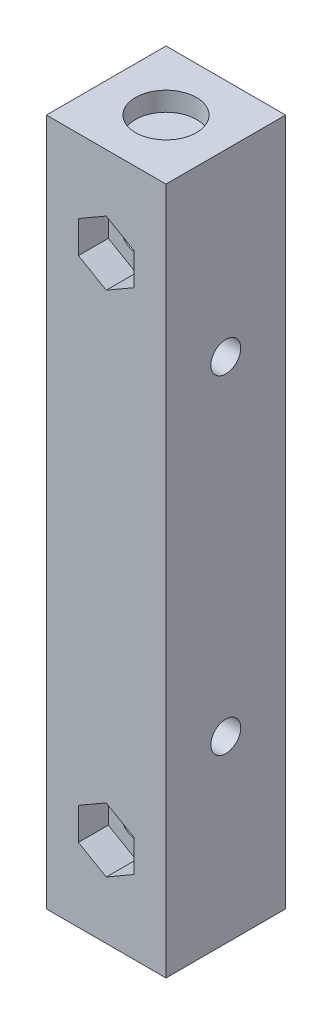
ISO-10303-21;
HEADER;
FILE_DESCRIPTION(('STEP AP214'),'2;1');
FILE_NAME('part.step','',(''),(''),'','','');
FILE_SCHEMA(('AUTOMOTIVE_DESIGN { 1 0 10303 214 1 1 1 1 }'));
ENDSEC;
DATA;
#1=APPLICATION_CONTEXT('core data for automotive mechanical design processes');
#2=APPLICATION_PROTOCOL_DEFINITION('international standard','automotive_design',2000,#1);
#3=PRODUCT_CONTEXT('',#1,'mechanical');
#4=PRODUCT('Part','Part','',(#3));
#5=PRODUCT_RELATED_PRODUCT_CATEGORY('part','',(#4));
#6=PRODUCT_DEFINITION_FORMATION('','',#4);
#7=PRODUCT_DEFINITION_CONTEXT('part definition',#1,'design');
#8=PRODUCT_DEFINITION('design','',#6,#7);
#9=PRODUCT_DEFINITION_SHAPE('','',#8);
#10=(LENGTH_UNIT() NAMED_UNIT(*) SI_UNIT(.MILLI.,.METRE.));
#11=(NAMED_UNIT(*) PLANE_ANGLE_UNIT() SI_UNIT($,.RADIAN.));
#12=(NAMED_UNIT(*) SI_UNIT($,.STERADIAN.) SOLID_ANGLE_UNIT());
#13=UNCERTAINTY_MEASURE_WITH_UNIT(LENGTH_MEASURE(1.E-05),#10,'distance_accuracy_value','');
#14=(GEOMETRIC_REPRESENTATION_CONTEXT(3) GLOBAL_UNCERTAINTY_ASSIGNED_CONTEXT((#13)) GLOBAL_UNIT_ASSIGNED_CONTEXT((#10,
#11,#12)) REPRESENTATION_CONTEXT('',''));
#15=CARTESIAN_POINT('',(0.,0.,0.));
#16=DIRECTION('',(0.,0.,1.));
#17=DIRECTION('',(1.,0.,0.));
#18=AXIS2_PLACEMENT_3D('',#15,#16,#17);
#19=CARTESIAN_POINT('',(865.,5.,-700.));
#20=DIRECTION('',(0.,1.,0.));
#21=DIRECTION('',(0.,0.,1.));
#22=AXIS2_PLACEMENT_3D('',#19,#20,#21);
#23=PLANE('',#22);
#24=DIRECTION('',(0.,0.,1.));
#25=VECTOR('',#24,1.);
#26=CARTESIAN_POINT('',(0.,5.,0.));
#27=LINE('',#26,#25);
#28=CARTESIAN_POINT('',(0.,5.,-20.));
#29=VERTEX_POINT('',#28);
#30=CARTESIAN_POINT('',(0.,5.,0.));
#31=VERTEX_POINT('',#30);
#32=EDGE_CURVE('E44',#29,#31,#27,.T.);
#33=ORIENTED_EDGE('',*,*,#32,.F.);
#34=DIRECTION('',(-1.,0.,0.));
#35=VECTOR('',#34,1.);
#36=CARTESIAN_POINT('',(0.,5.,-20.));
#37=LINE('',#36,#35);
#38=CARTESIAN_POINT('',(20.,5.,-20.));
#39=VERTEX_POINT('',#38);
#40=EDGE_CURVE('E487',#39,#29,#37,.T.);
#41=ORIENTED_EDGE('',*,*,#40,.F.);
#42=DIRECTION('',(0.,0.,-1.));
#43=VECTOR('',#42,1.);
#44=CARTESIAN_POINT('',(20.,5.,0.));
#45=LINE('',#44,#43);
#46=CARTESIAN_POINT('',(20.,5.,0.));
#47=VERTEX_POINT('',#46);
#48=EDGE_CURVE('E481',#47,#39,#45,.T.);
#49=ORIENTED_EDGE('',*,*,#48,.F.);
#50=DIRECTION('',(1.,0.,0.));
#51=VECTOR('',#50,1.);
#52=CARTESIAN_POINT('',(0.,5.,0.));
#53=LINE('',#52,#51);
#54=EDGE_CURVE('E510',#31,#47,#53,.T.);
#55=ORIENTED_EDGE('',*,*,#54,.F.);
#56=EDGE_LOOP('',(#33,#41,#49,#55));
#57=FACE_BOUND('',#56,.T.);
#58=ADVANCED_FACE('F40',(#57),#23,.F.);
#59=CARTESIAN_POINT('',(10.,116.8,-10.));
#60=DIRECTION('',(0.,1.,0.));
#61=DIRECTION('',(0.,0.,1.));
#62=AXIS2_PLACEMENT_3D('',#59,#60,#61);
#63=PLANE('',#62);
#64=CARTESIAN_POINT('',(10.,116.8,-10.));
#65=DIRECTION('',(0.,1.,0.));
#66=DIRECTION('',(0.,0.,1.));
#67=AXIS2_PLACEMENT_3D('',#64,#65,#66);
#68=CIRCLE('',#67,5.1);
#69=CARTESIAN_POINT('',(10.,116.8,-4.9));
#70=VERTEX_POINT('',#69);
#71=EDGE_CURVE('E50',#70,#70,#68,.T.);
#72=ORIENTED_EDGE('',*,*,#71,.T.);
#73=EDGE_LOOP('',(#72));
#74=FACE_BOUND('',#73,.T.);
#75=ADVANCED_FACE('F550',(#74),#63,.T.);
#76=CARTESIAN_POINT('',(5.,-55.,0.));
#77=DIRECTION('',(-1.,0.,0.));
#78=DIRECTION('',(0.,0.,1.));
#79=AXIS2_PLACEMENT_3D('',#76,#77,#78);
#80=PLANE('',#79);
#81=CARTESIAN_POINT('',(5.,35.,-9.99999999999999));
#82=DIRECTION('',(-1.,0.,0.));
#83=DIRECTION('',(0.,0.,1.));
#84=AXIS2_PLACEMENT_3D('',#81,#82,#83);
#85=CIRCLE('',#84,2.5);
#86=CARTESIAN_POINT('',(5.,35.,-7.49999999999999));
#87=VERTEX_POINT('',#86);
#88=EDGE_CURVE('E372',#87,#87,#85,.F.);
#89=ORIENTED_EDGE('',*,*,#88,.T.);
#90=EDGE_LOOP('',(#89));
#91=FACE_BOUND('',#90,.T.);
#92=DIRECTION('',(0.,0.500000000000001,0.866025403784438));
#93=VECTOR('',#92,1.);
#94=CARTESIAN_POINT('',(5.,12.8031088913245,-39.1461431702998));
#95=LINE('',#94,#93);
#96=CARTESIAN_POINT('',(5.,29.6306424965365,-9.99999999999997));
#97=VERTEX_POINT('',#96);
#98=CARTESIAN_POINT('',(5.,32.3153212482682,-5.34999999999999));
#99=VERTEX_POINT('',#98);
#100=EDGE_CURVE('E376',#97,#99,#95,.T.);
#101=ORIENTED_EDGE('',*,*,#100,.T.);
#102=DIRECTION('',(0.,1.,0.));
#103=VECTOR('',#102,1.);
#104=CARTESIAN_POINT('',(5.,-55.,-5.34999999999998));
#105=LINE('',#104,#103);
#106=CARTESIAN_POINT('',(5.,37.6846787517318,-5.34999999999999));
#107=VERTEX_POINT('',#106);
#108=EDGE_CURVE('E379',#99,#107,#105,.T.);
#109=ORIENTED_EDGE('',*,*,#108,.T.);
#110=DIRECTION('',(0.,-0.500000000000001,0.866025403784438));
#111=VECTOR('',#110,1.);
#112=CARTESIAN_POINT('',(5.,12.1968911086753,38.7961431702998));
#113=LINE('',#112,#111);
#114=CARTESIAN_POINT('',(5.,40.3693575034636,-9.99999999999999));
#115=VERTEX_POINT('',#114);
#116=EDGE_CURVE('E382',#115,#107,#113,.T.);
#117=ORIENTED_EDGE('',*,*,#116,.F.);
#118=DIRECTION('',(0.,0.500000000000002,0.866025403784438));
#119=VECTOR('',#118,1.);
#120=CARTESIAN_POINT('',(5.,20.8571451465197,-43.7961431702999));
#121=LINE('',#120,#119);
#122=CARTESIAN_POINT('',(5.,37.6846787517318,-14.65));
#123=VERTEX_POINT('',#122);
#124=EDGE_CURVE('E384',#123,#115,#121,.T.);
#125=ORIENTED_EDGE('',*,*,#124,.F.);
#126=DIRECTION('',(0.,1.,0.));
#127=VECTOR('',#126,1.);
#128=CARTESIAN_POINT('',(5.,-55.,-14.65));
#129=LINE('',#128,#127);
#130=CARTESIAN_POINT('',(5.,32.3153212482682,-14.65));
#131=VERTEX_POINT('',#130);
#132=EDGE_CURVE('E387',#131,#123,#129,.T.);
#133=ORIENTED_EDGE('',*,*,#132,.F.);
#134=DIRECTION('',(0.,0.5,-0.866025403784438));
#135=VECTOR('',#134,1.);
#136=CARTESIAN_POINT('',(5.,4.14285485348015,34.1461431702998));
#137=LINE('',#136,#135);
#138=EDGE_CURVE('E390',#97,#131,#137,.T.);
#139=ORIENTED_EDGE('',*,*,#138,.F.);
#140=EDGE_LOOP('',(#101,#109,#117,#125,#133,#139));
#141=FACE_BOUND('',#140,.T.);
#142=ADVANCED_FACE('F554',(#91,#141),#80,.T.);
#143=CARTESIAN_POINT('',(5.,0.,0.));
#144=DIRECTION('',(-1.,0.,0.));
#145=DIRECTION('',(0.,0.,1.));
#146=AXIS2_PLACEMENT_3D('',#143,#144,#145);
#147=PLANE('',#146);
#148=CARTESIAN_POINT('',(5.,90.,-9.99999999999999));
#149=DIRECTION('',(-1.,0.,0.));
#150=DIRECTION('',(0.,0.,1.));
#151=AXIS2_PLACEMENT_3D('',#148,#149,#150);
#152=CIRCLE('',#151,2.5);
#153=CARTESIAN_POINT('',(5.,90.,-7.49999999999999));
#154=VERTEX_POINT('',#153);
#155=EDGE_CURVE('E425',#154,#154,#152,.F.);
#156=ORIENTED_EDGE('',*,*,#155,.T.);
#157=EDGE_LOOP('',(#156));
#158=FACE_BOUND('',#157,.T.);
#159=DIRECTION('',(0.,0.500000000000001,0.866025403784438));
#160=VECTOR('',#159,1.);
#161=CARTESIAN_POINT('',(5.,67.8031088913245,-39.1461431702998));
#162=LINE('',#161,#160);
#163=CARTESIAN_POINT('',(5.,84.6306424965365,-9.99999999999997));
#164=VERTEX_POINT('',#163);
#165=CARTESIAN_POINT('',(5.,87.3153212482682,-5.34999999999999));
#166=VERTEX_POINT('',#165);
#167=EDGE_CURVE('E429',#164,#166,#162,.T.);
#168=ORIENTED_EDGE('',*,*,#167,.T.);
#169=DIRECTION('',(0.,1.,0.));
#170=VECTOR('',#169,1.);
#171=CARTESIAN_POINT('',(5.,0.,-5.34999999999998));
#172=LINE('',#171,#170);
#173=CARTESIAN_POINT('',(5.,92.6846787517318,-5.34999999999999));
#174=VERTEX_POINT('',#173);
#175=EDGE_CURVE('E432',#166,#174,#172,.T.);
#176=ORIENTED_EDGE('',*,*,#175,.T.);
#177=DIRECTION('',(0.,-0.500000000000001,0.866025403784438));
#178=VECTOR('',#177,1.);
#179=CARTESIAN_POINT('',(5.,67.1968911086753,38.7961431702998));
#180=LINE('',#179,#178);
#181=CARTESIAN_POINT('',(5.,95.3693575034636,-9.99999999999999));
#182=VERTEX_POINT('',#181);
#183=EDGE_CURVE('E435',#182,#174,#180,.T.);
#184=ORIENTED_EDGE('',*,*,#183,.F.);
#185=DIRECTION('',(0.,0.500000000000002,0.866025403784438));
#186=VECTOR('',#185,1.);
#187=CARTESIAN_POINT('',(5.,75.8571451465197,-43.7961431702999));
#188=LINE('',#187,#186);
#189=CARTESIAN_POINT('',(5.,92.6846787517318,-14.65));
#190=VERTEX_POINT('',#189);
#191=EDGE_CURVE('E437',#190,#182,#188,.T.);
#192=ORIENTED_EDGE('',*,*,#191,.F.);
#193=DIRECTION('',(0.,1.,0.));
#194=VECTOR('',#193,1.);
#195=CARTESIAN_POINT('',(5.,0.,-14.65));
#196=LINE('',#195,#194);
#197=CARTESIAN_POINT('',(5.,87.3153212482682,-14.65));
#198=VERTEX_POINT('',#197);
#199=EDGE_CURVE('E440',#198,#190,#196,.T.);
#200=ORIENTED_EDGE('',*,*,#199,.F.);
#201=DIRECTION('',(0.,0.5,-0.866025403784438));
#202=VECTOR('',#201,1.);
#203=CARTESIAN_POINT('',(5.,59.1428548534802,34.1461431702998));
#204=LINE('',#203,#202);
#205=EDGE_CURVE('E443',#164,#198,#204,.T.);
#206=ORIENTED_EDGE('',*,*,#205,.F.);
#207=EDGE_LOOP('',(#168,#176,#184,#192,#200,#206));
#208=FACE_BOUND('',#207,.T.);
#209=ADVANCED_FACE('F596',(#158,#208),#147,.T.);
#210=CARTESIAN_POINT('',(10.,116.8,-10.));
#211=DIRECTION('',(0.,1.,0.));
#212=DIRECTION('',(0.,0.,1.));
#213=AXIS2_PLACEMENT_3D('',#210,#211,#212);
#214=CYLINDRICAL_SURFACE('',#213,5.1);
#215=ORIENTED_EDGE('',*,*,#71,.F.);
#216=EDGE_LOOP('',(#215));
#217=FACE_BOUND('',#216,.T.);
#218=CARTESIAN_POINT('',(10.,120.,-10.));
#219=DIRECTION('',(0.,1.,0.));
#220=DIRECTION('',(0.,0.,1.));
#221=AXIS2_PLACEMENT_3D('',#218,#219,#220);
#222=CIRCLE('',#221,5.1);
#223=CARTESIAN_POINT('',(10.,120.,-4.9));
#224=VERTEX_POINT('',#223);
#225=EDGE_CURVE('E11',#224,#224,#222,.T.);
#226=ORIENTED_EDGE('',*,*,#225,.T.);
#227=EDGE_LOOP('',(#226));
#228=FACE_BOUND('',#227,.T.);
#229=ADVANCED_FACE('F599',(#217,#228),#214,.F.);
#230=CARTESIAN_POINT('',(0.,0.,-5.));
#231=DIRECTION('',(0.,0.,1.));
#232=DIRECTION('',(1.,0.,0.));
#233=AXIS2_PLACEMENT_3D('',#230,#231,#232);
#234=PLANE('',#233);
#235=DIRECTION('',(0.,1.,0.));
#236=VECTOR('',#235,1.);
#237=CARTESIAN_POINT('',(14.6500000000001,0.,-5.));
#238=LINE('',#237,#236);
#239=CARTESIAN_POINT('',(14.65,17.3153212482683,-5.));
#240=VERTEX_POINT('',#239);
#241=CARTESIAN_POINT('',(14.65,22.6846787517318,-5.));
#242=VERTEX_POINT('',#241);
#243=EDGE_CURVE('E129',#240,#242,#238,.T.);
#244=ORIENTED_EDGE('',*,*,#243,.T.);
#245=DIRECTION('',(0.866025403784438,-0.500000000000002,0.));
#246=VECTOR('',#245,1.);
#247=CARTESIAN_POINT('',(13.4852540378444,23.3571451465198,-5.));
#248=LINE('',#247,#246);
#249=CARTESIAN_POINT('',(10.0000000000001,25.3693575034635,-5.));
#250=VERTEX_POINT('',#249);
#251=EDGE_CURVE('E119',#250,#242,#248,.T.);
#252=ORIENTED_EDGE('',*,*,#251,.F.);
#253=DIRECTION('',(0.866025403784444,0.499999999999991,0.));
#254=VECTOR('',#253,1.);
#255=CARTESIAN_POINT('',(-8.48525403784432,14.6968911086757,-5.));
#256=LINE('',#255,#254);
#257=CARTESIAN_POINT('',(5.35000000000003,22.6846787517318,-5.));
#258=VERTEX_POINT('',#257);
#259=EDGE_CURVE('E113',#258,#250,#256,.T.);
#260=ORIENTED_EDGE('',*,*,#259,.F.);
#261=DIRECTION('',(0.,1.,0.));
#262=VECTOR('',#261,1.);
#263=CARTESIAN_POINT('',(5.34999999999988,0.,-5.));
#264=LINE('',#263,#262);
#265=CARTESIAN_POINT('',(5.35,17.3153212482683,-5.));
#266=VERTEX_POINT('',#265);
#267=EDGE_CURVE('E206',#266,#258,#264,.T.);
#268=ORIENTED_EDGE('',*,*,#267,.F.);
#269=DIRECTION('',(-0.866025403784437,0.500000000000003,0.));
#270=VECTOR('',#269,1.);
#271=CARTESIAN_POINT('',(8.83525403784443,15.3031088913245,-5.));
#272=LINE('',#271,#270);
#273=CARTESIAN_POINT('',(9.99999999999993,14.6306424965365,-5.));
#274=VERTEX_POINT('',#273);
#275=EDGE_CURVE('E204',#274,#266,#272,.T.);
#276=ORIENTED_EDGE('',*,*,#275,.F.);
#277=DIRECTION('',(0.866025403784439,0.5,0.));
#278=VECTOR('',#277,1.);
#279=CARTESIAN_POINT('',(-3.83525403784442,6.64285485348023,-5.));
#280=LINE('',#279,#278);
#281=EDGE_CURVE('E144',#274,#240,#280,.T.);
#282=ORIENTED_EDGE('',*,*,#281,.T.);
#283=EDGE_LOOP('',(#244,#252,#260,#268,#276,#282));
#284=FACE_BOUND('',#283,.T.);
#285=CARTESIAN_POINT('',(10.,20.,-5.));
#286=DIRECTION('',(0.,0.,1.));
#287=DIRECTION('',(1.,0.,0.));
#288=AXIS2_PLACEMENT_3D('',#285,#286,#287);
#289=CIRCLE('',#288,2.5);
#290=CARTESIAN_POINT('',(12.5,20.,-5.));
#291=VERTEX_POINT('',#290);
#292=EDGE_CURVE('E138',#291,#291,#289,.F.);
#293=ORIENTED_EDGE('',*,*,#292,.T.);
#294=EDGE_LOOP('',(#293));
#295=FACE_BOUND('',#294,.T.);
#296=ADVANCED_FACE('F140',(#284,#295),#234,.T.);
#297=CARTESIAN_POINT('',(0.,0.,-5.));
#298=DIRECTION('',(0.,0.,1.));
#299=DIRECTION('',(1.,0.,0.));
#300=AXIS2_PLACEMENT_3D('',#297,#298,#299);
#301=PLANE('',#300);
#302=DIRECTION('',(0.866025403784444,0.499999999999991,0.));
#303=VECTOR('',#302,1.);
#304=CARTESIAN_POINT('',(-45.2913336986825,78.4468911086764,-5.));
#305=LINE('',#304,#303);
#306=CARTESIAN_POINT('',(5.35000000000003,107.684678751732,-5.));
#307=VERTEX_POINT('',#306);
#308=CARTESIAN_POINT('',(10.0000000000001,110.369357503464,-5.));
#309=VERTEX_POINT('',#308);
#310=EDGE_CURVE('E330',#307,#309,#305,.T.);
#311=ORIENTED_EDGE('',*,*,#310,.F.);
#312=DIRECTION('',(0.,1.,0.));
#313=VECTOR('',#312,1.);
#314=CARTESIAN_POINT('',(5.34999999999932,0.,-5.));
#315=LINE('',#314,#313);
#316=CARTESIAN_POINT('',(5.35,102.315321248268,-5.));
#317=VERTEX_POINT('',#316);
#318=EDGE_CURVE('E334',#317,#307,#315,.T.);
#319=ORIENTED_EDGE('',*,*,#318,.F.);
#320=DIRECTION('',(-0.866025403784437,0.500000000000003,0.));
#321=VECTOR('',#320,1.);
#322=CARTESIAN_POINT('',(45.6413336986832,79.0531088913243,-5.));
#323=LINE('',#322,#321);
#324=CARTESIAN_POINT('',(9.99999999999994,99.6306424965365,-5.));
#325=VERTEX_POINT('',#324);
#326=EDGE_CURVE('E59',#325,#317,#323,.T.);
#327=ORIENTED_EDGE('',*,*,#326,.F.);
#328=DIRECTION('',(0.866025403784439,0.499999999999999,0.));
#329=VECTOR('',#328,1.);
#330=CARTESIAN_POINT('',(-40.641333698683,70.3928548534803,-5.));
#331=LINE('',#330,#329);
#332=CARTESIAN_POINT('',(14.65,102.315321248268,-5.));
#333=VERTEX_POINT('',#332);
#334=EDGE_CURVE('E363',#325,#333,#331,.T.);
#335=ORIENTED_EDGE('',*,*,#334,.T.);
#336=DIRECTION('',(0.,1.,0.));
#337=VECTOR('',#336,1.);
#338=CARTESIAN_POINT('',(14.6500000000005,0.,-5.));
#339=LINE('',#338,#337);
#340=CARTESIAN_POINT('',(14.65,107.684678751732,-5.));
#341=VERTEX_POINT('',#340);
#342=EDGE_CURVE('E361',#333,#341,#339,.T.);
#343=ORIENTED_EDGE('',*,*,#342,.T.);
#344=DIRECTION('',(0.866025403784438,-0.500000000000002,0.));
#345=VECTOR('',#344,1.);
#346=CARTESIAN_POINT('',(50.2913336986832,87.1071451465197,-5.));
#347=LINE('',#346,#345);
#348=EDGE_CURVE('E336',#309,#341,#347,.T.);
#349=ORIENTED_EDGE('',*,*,#348,.F.);
#350=EDGE_LOOP('',(#311,#319,#327,#335,#343,#349));
#351=FACE_BOUND('',#350,.T.);
#352=CARTESIAN_POINT('',(10.,105.,-5.));
#353=DIRECTION('',(0.,0.,1.));
#354=DIRECTION('',(1.,0.,0.));
#355=AXIS2_PLACEMENT_3D('',#352,#353,#354);
#356=CIRCLE('',#355,2.5);
#357=CARTESIAN_POINT('',(12.5,105.,-5.));
#358=VERTEX_POINT('',#357);
#359=EDGE_CURVE('E187',#358,#358,#356,.F.);
#360=ORIENTED_EDGE('',*,*,#359,.T.);
#361=EDGE_LOOP('',(#360));
#362=FACE_BOUND('',#361,.T.);
#363=ADVANCED_FACE('F332',(#351,#362),#301,.T.);
#364=CARTESIAN_POINT('',(-45.2913336986825,78.4468911086764,-5.));
#365=DIRECTION('',(0.499999999999991,-0.866025403784444,0.));
#366=DIRECTION('',(0.866025403784444,0.499999999999991,0.));
#367=AXIS2_PLACEMENT_3D('',#364,#365,#366);
#368=PLANE('',#367);
#369=DIRECTION('',(0.,0.,1.));
#370=VECTOR('',#369,1.);
#371=CARTESIAN_POINT('',(5.35000000000003,107.684678751732,-5.));
#372=LINE('',#371,#370);
#373=CARTESIAN_POINT('',(5.35000000000003,107.684678751732,0.));
#374=VERTEX_POINT('',#373);
#375=EDGE_CURVE('E162',#307,#374,#372,.T.);
#376=ORIENTED_EDGE('',*,*,#375,.F.);
#377=ORIENTED_EDGE('',*,*,#310,.T.);
#378=DIRECTION('',(0.,0.,1.));
#379=VECTOR('',#378,1.);
#380=CARTESIAN_POINT('',(10.0000000000001,110.369357503464,-5.));
#381=LINE('',#380,#379);
#382=CARTESIAN_POINT('',(10.0000000000001,110.369357503464,0.));
#383=VERTEX_POINT('',#382);
#384=EDGE_CURVE('E170',#309,#383,#381,.T.);
#385=ORIENTED_EDGE('',*,*,#384,.T.);
#386=DIRECTION('',(0.866025403784444,0.499999999999991,0.));
#387=VECTOR('',#386,1.);
#388=CARTESIAN_POINT('',(-45.2913336986825,78.4468911086764,0.));
#389=LINE('',#388,#387);
#390=EDGE_CURVE('E348',#374,#383,#389,.T.);
#391=ORIENTED_EDGE('',*,*,#390,.F.);
#392=EDGE_LOOP('',(#376,#377,#385,#391));
#393=FACE_BOUND('',#392,.T.);
#394=ADVANCED_FACE('F346',(#393),#368,.T.);
#395=CARTESIAN_POINT('',(5.34999999999932,0.,-5.));
#396=DIRECTION('',(1.,0.,0.));
#397=DIRECTION('',(0.,1.,0.));
#398=AXIS2_PLACEMENT_3D('',#395,#396,#397);
#399=PLANE('',#398);
#400=DIRECTION('',(0.,0.,1.));
#401=VECTOR('',#400,1.);
#402=CARTESIAN_POINT('',(5.35,102.315321248268,-5.));
#403=LINE('',#402,#401);
#404=CARTESIAN_POINT('',(5.35,102.315321248268,0.));
#405=VERTEX_POINT('',#404);
#406=EDGE_CURVE('E156',#317,#405,#403,.T.);
#407=ORIENTED_EDGE('',*,*,#406,.F.);
#408=ORIENTED_EDGE('',*,*,#318,.T.);
#409=ORIENTED_EDGE('',*,*,#375,.T.);
#410=DIRECTION('',(0.,1.,0.));
#411=VECTOR('',#410,1.);
#412=CARTESIAN_POINT('',(5.34999999999932,0.,0.));
#413=LINE('',#412,#411);
#414=EDGE_CURVE('E350',#405,#374,#413,.T.);
#415=ORIENTED_EDGE('',*,*,#414,.F.);
#416=EDGE_LOOP('',(#407,#408,#409,#415));
#417=FACE_BOUND('',#416,.T.);
#418=ADVANCED_FACE('F343',(#417),#399,.T.);
#419=CARTESIAN_POINT('',(45.6413336986832,79.0531088913243,-5.));
#420=DIRECTION('',(0.500000000000003,0.866025403784437,0.));
#421=DIRECTION('',(-0.866025403784437,0.500000000000003,0.));
#422=AXIS2_PLACEMENT_3D('',#419,#420,#421);
#423=PLANE('',#422);
#424=DIRECTION('',(0.,0.,1.));
#425=VECTOR('',#424,1.);
#426=CARTESIAN_POINT('',(9.99999999999994,99.6306424965365,-5.));
#427=LINE('',#426,#425);
#428=CARTESIAN_POINT('',(9.99999999999994,99.6306424965365,0.));
#429=VERTEX_POINT('',#428);
#430=EDGE_CURVE('E152',#325,#429,#427,.T.);
#431=ORIENTED_EDGE('',*,*,#430,.F.);
#432=ORIENTED_EDGE('',*,*,#326,.T.);
#433=ORIENTED_EDGE('',*,*,#406,.T.);
#434=DIRECTION('',(-0.866025403784437,0.500000000000003,0.));
#435=VECTOR('',#434,1.);
#436=CARTESIAN_POINT('',(45.6413336986832,79.0531088913243,0.));
#437=LINE('',#436,#435);
#438=EDGE_CURVE('E165',#429,#405,#437,.T.);
#439=ORIENTED_EDGE('',*,*,#438,.F.);
#440=EDGE_LOOP('',(#431,#432,#433,#439));
#441=FACE_BOUND('',#440,.T.);
#442=ADVANCED_FACE('F632',(#441),#423,.T.);
#443=CARTESIAN_POINT('',(-40.641333698683,70.3928548534803,-5.));
#444=DIRECTION('',(0.499999999999999,-0.866025403784439,0.));
#445=DIRECTION('',(0.866025403784439,0.499999999999999,0.));
#446=AXIS2_PLACEMENT_3D('',#443,#444,#445);
#447=PLANE('',#446);
#448=DIRECTION('',(0.866025403784439,0.499999999999999,0.));
#449=VECTOR('',#448,1.);
#450=CARTESIAN_POINT('',(-40.641333698683,70.3928548534803,0.));
#451=LINE('',#450,#449);
#452=CARTESIAN_POINT('',(14.65,102.315321248268,0.));
#453=VERTEX_POINT('',#452);
#454=EDGE_CURVE('E200',#429,#453,#451,.T.);
#455=ORIENTED_EDGE('',*,*,#454,.T.);
#456=DIRECTION('',(0.,0.,1.));
#457=VECTOR('',#456,1.);
#458=CARTESIAN_POINT('',(14.65,102.315321248268,-5.));
#459=LINE('',#458,#457);
#460=EDGE_CURVE('E176',#333,#453,#459,.T.);
#461=ORIENTED_EDGE('',*,*,#460,.F.);
#462=ORIENTED_EDGE('',*,*,#334,.F.);
#463=ORIENTED_EDGE('',*,*,#430,.T.);
#464=EDGE_LOOP('',(#455,#461,#462,#463));
#465=FACE_BOUND('',#464,.T.);
#466=ADVANCED_FACE('F635',(#465),#447,.F.);
#467=CARTESIAN_POINT('',(14.6500000000005,0.,-5.));
#468=DIRECTION('',(1.,0.,0.));
#469=DIRECTION('',(0.,1.,0.));
#470=AXIS2_PLACEMENT_3D('',#467,#468,#469);
#471=PLANE('',#470);
#472=ORIENTED_EDGE('',*,*,#460,.T.);
#473=DIRECTION('',(0.,1.,0.));
#474=VECTOR('',#473,1.);
#475=CARTESIAN_POINT('',(14.6500000000005,0.,0.));
#476=LINE('',#475,#474);
#477=CARTESIAN_POINT('',(14.65,107.684678751732,0.));
#478=VERTEX_POINT('',#477);
#479=EDGE_CURVE('E353',#453,#478,#476,.T.);
#480=ORIENTED_EDGE('',*,*,#479,.T.);
#481=DIRECTION('',(0.,0.,1.));
#482=VECTOR('',#481,1.);
#483=CARTESIAN_POINT('',(14.65,107.684678751732,-5.));
#484=LINE('',#483,#482);
#485=EDGE_CURVE('E173',#341,#478,#484,.T.);
#486=ORIENTED_EDGE('',*,*,#485,.F.);
#487=ORIENTED_EDGE('',*,*,#342,.F.);
#488=EDGE_LOOP('',(#472,#480,#486,#487));
#489=FACE_BOUND('',#488,.T.);
#490=ADVANCED_FACE('F644',(#489),#471,.F.);
#491=CARTESIAN_POINT('',(50.2913336986832,87.1071451465197,-5.));
#492=DIRECTION('',(-0.500000000000002,-0.866025403784438,0.));
#493=DIRECTION('',(0.866025403784438,-0.500000000000002,0.));
#494=AXIS2_PLACEMENT_3D('',#491,#492,#493);
#495=PLANE('',#494);
#496=ORIENTED_EDGE('',*,*,#384,.F.);
#497=ORIENTED_EDGE('',*,*,#348,.T.);
#498=ORIENTED_EDGE('',*,*,#485,.T.);
#499=DIRECTION('',(0.866025403784438,-0.500000000000002,0.));
#500=VECTOR('',#499,1.);
#501=CARTESIAN_POINT('',(50.2913336986832,87.1071451465197,0.));
#502=LINE('',#501,#500);
#503=EDGE_CURVE('E351',#383,#478,#502,.T.);
#504=ORIENTED_EDGE('',*,*,#503,.F.);
#505=EDGE_LOOP('',(#496,#497,#498,#504));
#506=FACE_BOUND('',#505,.T.);
#507=ADVANCED_FACE('F641',(#506),#495,.T.);
#508=CARTESIAN_POINT('',(-8.48525403784432,14.6968911086757,-5.));
#509=DIRECTION('',(0.499999999999991,-0.866025403784444,0.));
#510=DIRECTION('',(0.866025403784444,0.499999999999991,0.));
#511=AXIS2_PLACEMENT_3D('',#508,#509,#510);
#512=PLANE('',#511);
#513=DIRECTION('',(0.866025403784444,0.499999999999991,0.));
#514=VECTOR('',#513,1.);
#515=CARTESIAN_POINT('',(-8.48525403784432,14.6968911086757,0.));
#516=LINE('',#515,#514);
#517=CARTESIAN_POINT('',(5.35000000000003,22.6846787517318,0.));
#518=VERTEX_POINT('',#517);
#519=CARTESIAN_POINT('',(10.0000000000001,25.3693575034635,0.));
#520=VERTEX_POINT('',#519);
#521=EDGE_CURVE('E194',#518,#520,#516,.T.);
#522=ORIENTED_EDGE('',*,*,#521,.F.);
#523=DIRECTION('',(0.,0.,1.));
#524=VECTOR('',#523,1.);
#525=CARTESIAN_POINT('',(5.35000000000003,22.6846787517318,-5.));
#526=LINE('',#525,#524);
#527=EDGE_CURVE('E180',#258,#518,#526,.T.);
#528=ORIENTED_EDGE('',*,*,#527,.F.);
#529=ORIENTED_EDGE('',*,*,#259,.T.);
#530=DIRECTION('',(0.,0.,1.));
#531=VECTOR('',#530,1.);
#532=CARTESIAN_POINT('',(10.0000000000001,25.3693575034635,-5.));
#533=LINE('',#532,#531);
#534=EDGE_CURVE('E126',#250,#520,#533,.T.);
#535=ORIENTED_EDGE('',*,*,#534,.T.);
#536=EDGE_LOOP('',(#522,#528,#529,#535));
#537=FACE_BOUND('',#536,.T.);
#538=ADVANCED_FACE('F213',(#537),#512,.T.);
#539=CARTESIAN_POINT('',(5.34999999999988,0.,-5.));
#540=DIRECTION('',(1.,0.,0.));
#541=DIRECTION('',(0.,1.,0.));
#542=AXIS2_PLACEMENT_3D('',#539,#540,#541);
#543=PLANE('',#542);
#544=DIRECTION('',(0.,1.,0.));
#545=VECTOR('',#544,1.);
#546=CARTESIAN_POINT('',(5.34999999999988,0.,0.));
#547=LINE('',#546,#545);
#548=CARTESIAN_POINT('',(5.35,17.3153212482683,0.));
#549=VERTEX_POINT('',#548);
#550=EDGE_CURVE('E191',#549,#518,#547,.T.);
#551=ORIENTED_EDGE('',*,*,#550,.F.);
#552=DIRECTION('',(0.,0.,1.));
#553=VECTOR('',#552,1.);
#554=CARTESIAN_POINT('',(5.35,17.3153212482683,-5.));
#555=LINE('',#554,#553);
#556=EDGE_CURVE('E182',#266,#549,#555,.T.);
#557=ORIENTED_EDGE('',*,*,#556,.F.);
#558=ORIENTED_EDGE('',*,*,#267,.T.);
#559=ORIENTED_EDGE('',*,*,#527,.T.);
#560=EDGE_LOOP('',(#551,#557,#558,#559));
#561=FACE_BOUND('',#560,.T.);
#562=ADVANCED_FACE('F211',(#561),#543,.T.);
#563=CARTESIAN_POINT('',(8.83525403784443,15.3031088913245,-5.));
#564=DIRECTION('',(0.500000000000003,0.866025403784437,0.));
#565=DIRECTION('',(-0.866025403784437,0.500000000000003,0.));
#566=AXIS2_PLACEMENT_3D('',#563,#564,#565);
#567=PLANE('',#566);
#568=DIRECTION('',(-0.866025403784437,0.500000000000003,0.));
#569=VECTOR('',#568,1.);
#570=CARTESIAN_POINT('',(8.83525403784443,15.3031088913245,0.));
#571=LINE('',#570,#569);
#572=CARTESIAN_POINT('',(9.99999999999993,14.6306424965365,0.));
#573=VERTEX_POINT('',#572);
#574=EDGE_CURVE('E148',#573,#549,#571,.T.);
#575=ORIENTED_EDGE('',*,*,#574,.F.);
#576=DIRECTION('',(0.,0.,1.));
#577=VECTOR('',#576,1.);
#578=CARTESIAN_POINT('',(9.99999999999993,14.6306424965365,-5.));
#579=LINE('',#578,#577);
#580=EDGE_CURVE('E184',#274,#573,#579,.T.);
#581=ORIENTED_EDGE('',*,*,#580,.F.);
#582=ORIENTED_EDGE('',*,*,#275,.T.);
#583=ORIENTED_EDGE('',*,*,#556,.T.);
#584=EDGE_LOOP('',(#575,#581,#582,#583));
#585=FACE_BOUND('',#584,.T.);
#586=ADVANCED_FACE('F219',(#585),#567,.T.);
#587=CARTESIAN_POINT('',(-3.83525403784442,6.64285485348023,-5.));
#588=DIRECTION('',(0.5,-0.866025403784439,0.));
#589=DIRECTION('',(0.866025403784439,0.5,0.));
#590=AXIS2_PLACEMENT_3D('',#587,#588,#589);
#591=PLANE('',#590);
#592=DIRECTION('',(0.866025403784439,0.5,0.));
#593=VECTOR('',#592,1.);
#594=CARTESIAN_POINT('',(-3.83525403784442,6.64285485348023,0.));
#595=LINE('',#594,#593);
#596=CARTESIAN_POINT('',(14.65,17.3153212482683,0.));
#597=VERTEX_POINT('',#596);
#598=EDGE_CURVE('E145',#573,#597,#595,.T.);
#599=ORIENTED_EDGE('',*,*,#598,.T.);
#600=DIRECTION('',(0.,0.,1.));
#601=VECTOR('',#600,1.);
#602=CARTESIAN_POINT('',(14.65,17.3153212482683,-5.));
#603=LINE('',#602,#601);
#604=EDGE_CURVE('E186',#240,#597,#603,.T.);
#605=ORIENTED_EDGE('',*,*,#604,.F.);
#606=ORIENTED_EDGE('',*,*,#281,.F.);
#607=ORIENTED_EDGE('',*,*,#580,.T.);
#608=EDGE_LOOP('',(#599,#605,#606,#607));
#609=FACE_BOUND('',#608,.T.);
#610=ADVANCED_FACE('F221',(#609),#591,.F.);
#611=CARTESIAN_POINT('',(14.6500000000001,0.,-5.));
#612=DIRECTION('',(1.,0.,0.));
#613=DIRECTION('',(0.,1.,0.));
#614=AXIS2_PLACEMENT_3D('',#611,#612,#613);
#615=PLANE('',#614);
#616=DIRECTION('',(0.,1.,0.));
#617=VECTOR('',#616,1.);
#618=CARTESIAN_POINT('',(14.6500000000001,0.,0.));
#619=LINE('',#618,#617);
#620=CARTESIAN_POINT('',(14.65,22.6846787517318,0.));
#621=VERTEX_POINT('',#620);
#622=EDGE_CURVE('E137',#597,#621,#619,.T.);
#623=ORIENTED_EDGE('',*,*,#622,.T.);
#624=DIRECTION('',(0.,0.,1.));
#625=VECTOR('',#624,1.);
#626=CARTESIAN_POINT('',(14.65,22.6846787517318,-5.));
#627=LINE('',#626,#625);
#628=EDGE_CURVE('E124',#242,#621,#627,.T.);
#629=ORIENTED_EDGE('',*,*,#628,.F.);
#630=ORIENTED_EDGE('',*,*,#243,.F.);
#631=ORIENTED_EDGE('',*,*,#604,.T.);
#632=EDGE_LOOP('',(#623,#629,#630,#631));
#633=FACE_BOUND('',#632,.T.);
#634=ADVANCED_FACE('F134',(#633),#615,.F.);
#635=CARTESIAN_POINT('',(13.4852540378444,23.3571451465198,-5.));
#636=DIRECTION('',(-0.500000000000002,-0.866025403784438,0.));
#637=DIRECTION('',(0.866025403784438,-0.500000000000002,0.));
#638=AXIS2_PLACEMENT_3D('',#635,#636,#637);
#639=PLANE('',#638);
#640=DIRECTION('',(0.866025403784438,-0.500000000000002,0.));
#641=VECTOR('',#640,1.);
#642=CARTESIAN_POINT('',(13.4852540378444,23.3571451465198,0.));
#643=LINE('',#642,#641);
#644=EDGE_CURVE('E197',#520,#621,#643,.T.);
#645=ORIENTED_EDGE('',*,*,#644,.F.);
#646=ORIENTED_EDGE('',*,*,#534,.F.);
#647=ORIENTED_EDGE('',*,*,#251,.T.);
#648=ORIENTED_EDGE('',*,*,#628,.T.);
#649=EDGE_LOOP('',(#645,#646,#647,#648));
#650=FACE_BOUND('',#649,.T.);
#651=ADVANCED_FACE('F122',(#650),#639,.T.);
#652=CARTESIAN_POINT('',(5.,67.1968911086753,38.7961431702998));
#653=DIRECTION('',(0.,-0.866025403784438,-0.500000000000001));
#654=DIRECTION('',(0.,0.500000000000001,-0.866025403784438));
#655=AXIS2_PLACEMENT_3D('',#652,#653,#654);
#656=PLANE('',#655);
#657=DIRECTION('',(0.,-0.500000000000001,0.866025403784438));
#658=VECTOR('',#657,1.);
#659=CARTESIAN_POINT('',(0.,67.1968911086753,38.7961431702998));
#660=LINE('',#659,#658);
#661=CARTESIAN_POINT('',(0.,95.3693575034636,-9.99999999999999));
#662=VERTEX_POINT('',#661);
#663=CARTESIAN_POINT('',(0.,92.6846787517318,-5.34999999999999));
#664=VERTEX_POINT('',#663);
#665=EDGE_CURVE('E451',#662,#664,#660,.T.);
#666=ORIENTED_EDGE('',*,*,#665,.F.);
#667=DIRECTION('',(-1.,0.,0.));
#668=VECTOR('',#667,1.);
#669=CARTESIAN_POINT('',(5.,95.3693575034636,-9.99999999999999));
#670=LINE('',#669,#668);
#671=EDGE_CURVE('E471',#182,#662,#670,.T.);
#672=ORIENTED_EDGE('',*,*,#671,.F.);
#673=ORIENTED_EDGE('',*,*,#183,.T.);
#674=DIRECTION('',(-1.,0.,0.));
#675=VECTOR('',#674,1.);
#676=CARTESIAN_POINT('',(5.,92.6846787517318,-5.34999999999999));
#677=LINE('',#676,#675);
#678=EDGE_CURVE('E474',#174,#664,#677,.T.);
#679=ORIENTED_EDGE('',*,*,#678,.T.);
#680=EDGE_LOOP('',(#666,#672,#673,#679));
#681=FACE_BOUND('',#680,.T.);
#682=ADVANCED_FACE('F581',(#681),#656,.T.);
#683=CARTESIAN_POINT('',(5.,75.8571451465197,-43.7961431702999));
#684=DIRECTION('',(0.,-0.866025403784438,0.500000000000002));
#685=DIRECTION('',(0.,-0.500000000000002,-0.866025403784438));
#686=AXIS2_PLACEMENT_3D('',#683,#684,#685);
#687=PLANE('',#686);
#688=DIRECTION('',(0.,0.500000000000002,0.866025403784438));
#689=VECTOR('',#688,1.);
#690=CARTESIAN_POINT('',(0.,75.8571451465197,-43.7961431702999));
#691=LINE('',#690,#689);
#692=CARTESIAN_POINT('',(0.,92.6846787517318,-14.65));
#693=VERTEX_POINT('',#692);
#694=EDGE_CURVE('E454',#693,#662,#691,.T.);
#695=ORIENTED_EDGE('',*,*,#694,.F.);
#696=DIRECTION('',(-1.,0.,0.));
#697=VECTOR('',#696,1.);
#698=CARTESIAN_POINT('',(5.,92.6846787517318,-14.65));
#699=LINE('',#698,#697);
#700=EDGE_CURVE('E468',#190,#693,#699,.T.);
#701=ORIENTED_EDGE('',*,*,#700,.F.);
#702=ORIENTED_EDGE('',*,*,#191,.T.);
#703=ORIENTED_EDGE('',*,*,#671,.T.);
#704=EDGE_LOOP('',(#695,#701,#702,#703));
#705=FACE_BOUND('',#704,.T.);
#706=ADVANCED_FACE('F584',(#705),#687,.T.);
#707=CARTESIAN_POINT('',(5.,0.,-14.65));
#708=DIRECTION('',(0.,0.,1.));
#709=DIRECTION('',(1.,0.,0.));
#710=AXIS2_PLACEMENT_3D('',#707,#708,#709);
#711=PLANE('',#710);
#712=DIRECTION('',(0.,1.,0.));
#713=VECTOR('',#712,1.);
#714=CARTESIAN_POINT('',(0.,0.,-14.65));
#715=LINE('',#714,#713);
#716=CARTESIAN_POINT('',(0.,87.3153212482682,-14.65));
#717=VERTEX_POINT('',#716);
#718=EDGE_CURVE('E457',#717,#693,#715,.T.);
#719=ORIENTED_EDGE('',*,*,#718,.F.);
#720=DIRECTION('',(-1.,0.,0.));
#721=VECTOR('',#720,1.);
#722=CARTESIAN_POINT('',(5.,87.3153212482682,-14.65));
#723=LINE('',#722,#721);
#724=EDGE_CURVE('E464',#198,#717,#723,.T.);
#725=ORIENTED_EDGE('',*,*,#724,.F.);
#726=ORIENTED_EDGE('',*,*,#199,.T.);
#727=ORIENTED_EDGE('',*,*,#700,.T.);
#728=EDGE_LOOP('',(#719,#725,#726,#727));
#729=FACE_BOUND('',#728,.T.);
#730=ADVANCED_FACE('F588',(#729),#711,.T.);
#731=CARTESIAN_POINT('',(5.,59.1428548534802,34.1461431702998));
#732=DIRECTION('',(0.,0.866025403784438,0.5));
#733=DIRECTION('',(0.,-0.5,0.866025403784438));
#734=AXIS2_PLACEMENT_3D('',#731,#732,#733);
#735=PLANE('',#734);
#736=DIRECTION('',(0.,0.5,-0.866025403784438));
#737=VECTOR('',#736,1.);
#738=CARTESIAN_POINT('',(0.,59.1428548534802,34.1461431702998));
#739=LINE('',#738,#737);
#740=CARTESIAN_POINT('',(0.,84.6306424965365,-9.99999999999997));
#741=VERTEX_POINT('',#740);
#742=EDGE_CURVE('E428',#741,#717,#739,.T.);
#743=ORIENTED_EDGE('',*,*,#742,.F.);
#744=DIRECTION('',(-1.,0.,0.));
#745=VECTOR('',#744,1.);
#746=CARTESIAN_POINT('',(5.,84.6306424965365,-9.99999999999997));
#747=LINE('',#746,#745);
#748=EDGE_CURVE('E462',#164,#741,#747,.T.);
#749=ORIENTED_EDGE('',*,*,#748,.F.);
#750=ORIENTED_EDGE('',*,*,#205,.T.);
#751=ORIENTED_EDGE('',*,*,#724,.T.);
#752=EDGE_LOOP('',(#743,#749,#750,#751));
#753=FACE_BOUND('',#752,.T.);
#754=ADVANCED_FACE('F575',(#753),#735,.T.);
#755=CARTESIAN_POINT('',(5.,67.8031088913245,-39.1461431702998));
#756=DIRECTION('',(0.,-0.866025403784438,0.500000000000001));
#757=DIRECTION('',(0.,-0.500000000000001,-0.866025403784438));
#758=AXIS2_PLACEMENT_3D('',#755,#756,#757);
#759=PLANE('',#758);
#760=DIRECTION('',(0.,0.500000000000001,0.866025403784438));
#761=VECTOR('',#760,1.);
#762=CARTESIAN_POINT('',(0.,67.8031088913245,-39.1461431702998));
#763=LINE('',#762,#761);
#764=CARTESIAN_POINT('',(0.,87.3153212482682,-5.34999999999999));
#765=VERTEX_POINT('',#764);
#766=EDGE_CURVE('E412',#741,#765,#763,.T.);
#767=ORIENTED_EDGE('',*,*,#766,.T.);
#768=DIRECTION('',(-1.,0.,0.));
#769=VECTOR('',#768,1.);
#770=CARTESIAN_POINT('',(5.,87.3153212482682,-5.34999999999999));
#771=LINE('',#770,#769);
#772=EDGE_CURVE('E446',#166,#765,#771,.T.);
#773=ORIENTED_EDGE('',*,*,#772,.F.);
#774=ORIENTED_EDGE('',*,*,#167,.F.);
#775=ORIENTED_EDGE('',*,*,#748,.T.);
#776=EDGE_LOOP('',(#767,#773,#774,#775));
#777=FACE_BOUND('',#776,.T.);
#778=ADVANCED_FACE('F571',(#777),#759,.F.);
#779=CARTESIAN_POINT('',(5.,0.,-5.34999999999998));
#780=DIRECTION('',(0.,0.,1.));
#781=DIRECTION('',(0.,-1.,0.));
#782=AXIS2_PLACEMENT_3D('',#779,#780,#781);
#783=PLANE('',#782);
#784=DIRECTION('',(0.,1.,0.));
#785=VECTOR('',#784,1.);
#786=CARTESIAN_POINT('',(0.,0.,-5.34999999999998));
#787=LINE('',#786,#785);
#788=EDGE_CURVE('E448',#765,#664,#787,.T.);
#789=ORIENTED_EDGE('',*,*,#788,.T.);
#790=ORIENTED_EDGE('',*,*,#678,.F.);
#791=ORIENTED_EDGE('',*,*,#175,.F.);
#792=ORIENTED_EDGE('',*,*,#772,.T.);
#793=EDGE_LOOP('',(#789,#790,#791,#792));
#794=FACE_BOUND('',#793,.T.);
#795=ADVANCED_FACE('F574',(#794),#783,.F.);
#796=CARTESIAN_POINT('',(5.,12.1968911086753,38.7961431702998));
#797=DIRECTION('',(0.,-0.866025403784438,-0.500000000000001));
#798=DIRECTION('',(0.,0.500000000000001,-0.866025403784438));
#799=AXIS2_PLACEMENT_3D('',#796,#797,#798);
#800=PLANE('',#799);
#801=DIRECTION('',(0.,-0.500000000000001,0.866025403784438));
#802=VECTOR('',#801,1.);
#803=CARTESIAN_POINT('',(0.,12.1968911086753,38.7961431702998));
#804=LINE('',#803,#802);
#805=CARTESIAN_POINT('',(0.,40.3693575034636,-9.99999999999999));
#806=VERTEX_POINT('',#805);
#807=CARTESIAN_POINT('',(0.,37.6846787517318,-5.34999999999999));
#808=VERTEX_POINT('',#807);
#809=EDGE_CURVE('E398',#806,#808,#804,.T.);
#810=ORIENTED_EDGE('',*,*,#809,.F.);
#811=DIRECTION('',(-1.,0.,0.));
#812=VECTOR('',#811,1.);
#813=CARTESIAN_POINT('',(5.,40.3693575034636,-9.99999999999999));
#814=LINE('',#813,#812);
#815=EDGE_CURVE('E418',#115,#806,#814,.T.);
#816=ORIENTED_EDGE('',*,*,#815,.F.);
#817=ORIENTED_EDGE('',*,*,#116,.T.);
#818=DIRECTION('',(-1.,0.,0.));
#819=VECTOR('',#818,1.);
#820=CARTESIAN_POINT('',(5.,37.6846787517318,-5.34999999999999));
#821=LINE('',#820,#819);
#822=EDGE_CURVE('E421',#107,#808,#821,.T.);
#823=ORIENTED_EDGE('',*,*,#822,.T.);
#824=EDGE_LOOP('',(#810,#816,#817,#823));
#825=FACE_BOUND('',#824,.T.);
#826=ADVANCED_FACE('F579',(#825),#800,.T.);
#827=CARTESIAN_POINT('',(5.,20.8571451465197,-43.7961431702999));
#828=DIRECTION('',(0.,-0.866025403784438,0.500000000000002));
#829=DIRECTION('',(0.,-0.500000000000002,-0.866025403784438));
#830=AXIS2_PLACEMENT_3D('',#827,#828,#829);
#831=PLANE('',#830);
#832=DIRECTION('',(0.,0.500000000000002,0.866025403784438));
#833=VECTOR('',#832,1.);
#834=CARTESIAN_POINT('',(0.,20.8571451465197,-43.7961431702999));
#835=LINE('',#834,#833);
#836=CARTESIAN_POINT('',(0.,37.6846787517318,-14.65));
#837=VERTEX_POINT('',#836);
#838=EDGE_CURVE('E401',#837,#806,#835,.T.);
#839=ORIENTED_EDGE('',*,*,#838,.F.);
#840=DIRECTION('',(-1.,0.,0.));
#841=VECTOR('',#840,1.);
#842=CARTESIAN_POINT('',(5.,37.6846787517318,-14.65));
#843=LINE('',#842,#841);
#844=EDGE_CURVE('E415',#123,#837,#843,.T.);
#845=ORIENTED_EDGE('',*,*,#844,.F.);
#846=ORIENTED_EDGE('',*,*,#124,.T.);
#847=ORIENTED_EDGE('',*,*,#815,.T.);
#848=EDGE_LOOP('',(#839,#845,#846,#847));
#849=FACE_BOUND('',#848,.T.);
#850=ADVANCED_FACE('F612',(#849),#831,.T.);
#851=CARTESIAN_POINT('',(5.,-55.,-14.65));
#852=DIRECTION('',(0.,0.,1.));
#853=DIRECTION('',(1.,0.,0.));
#854=AXIS2_PLACEMENT_3D('',#851,#852,#853);
#855=PLANE('',#854);
#856=DIRECTION('',(0.,1.,0.));
#857=VECTOR('',#856,1.);
#858=CARTESIAN_POINT('',(0.,-55.,-14.65));
#859=LINE('',#858,#857);
#860=CARTESIAN_POINT('',(0.,32.3153212482682,-14.65));
#861=VERTEX_POINT('',#860);
#862=EDGE_CURVE('E404',#861,#837,#859,.T.);
#863=ORIENTED_EDGE('',*,*,#862,.F.);
#864=DIRECTION('',(-1.,0.,0.));
#865=VECTOR('',#864,1.);
#866=CARTESIAN_POINT('',(5.,32.3153212482682,-14.65));
#867=LINE('',#866,#865);
#868=EDGE_CURVE('E411',#131,#861,#867,.T.);
#869=ORIENTED_EDGE('',*,*,#868,.F.);
#870=ORIENTED_EDGE('',*,*,#132,.T.);
#871=ORIENTED_EDGE('',*,*,#844,.T.);
#872=EDGE_LOOP('',(#863,#869,#870,#871));
#873=FACE_BOUND('',#872,.T.);
#874=ADVANCED_FACE('F616',(#873),#855,.T.);
#875=CARTESIAN_POINT('',(5.,4.14285485348015,34.1461431702998));
#876=DIRECTION('',(0.,0.866025403784438,0.5));
#877=DIRECTION('',(0.,-0.5,0.866025403784438));
#878=AXIS2_PLACEMENT_3D('',#875,#876,#877);
#879=PLANE('',#878);
#880=DIRECTION('',(0.,0.5,-0.866025403784438));
#881=VECTOR('',#880,1.);
#882=CARTESIAN_POINT('',(0.,4.14285485348015,34.1461431702998));
#883=LINE('',#882,#881);
#884=CARTESIAN_POINT('',(0.,29.6306424965365,-9.99999999999997));
#885=VERTEX_POINT('',#884);
#886=EDGE_CURVE('E375',#885,#861,#883,.T.);
#887=ORIENTED_EDGE('',*,*,#886,.F.);
#888=DIRECTION('',(-1.,0.,0.));
#889=VECTOR('',#888,1.);
#890=CARTESIAN_POINT('',(5.,29.6306424965365,-9.99999999999997));
#891=LINE('',#890,#889);
#892=EDGE_CURVE('E409',#97,#885,#891,.T.);
#893=ORIENTED_EDGE('',*,*,#892,.F.);
#894=ORIENTED_EDGE('',*,*,#138,.T.);
#895=ORIENTED_EDGE('',*,*,#868,.T.);
#896=EDGE_LOOP('',(#887,#893,#894,#895));
#897=FACE_BOUND('',#896,.T.);
#898=ADVANCED_FACE('F605',(#897),#879,.T.);
#899=CARTESIAN_POINT('',(5.,12.8031088913245,-39.1461431702998));
#900=DIRECTION('',(0.,-0.866025403784438,0.500000000000001));
#901=DIRECTION('',(0.,-0.500000000000001,-0.866025403784438));
#902=AXIS2_PLACEMENT_3D('',#899,#900,#901);
#903=PLANE('',#902);
#904=DIRECTION('',(0.,0.500000000000001,0.866025403784438));
#905=VECTOR('',#904,1.);
#906=CARTESIAN_POINT('',(0.,12.8031088913245,-39.1461431702998));
#907=LINE('',#906,#905);
#908=CARTESIAN_POINT('',(0.,32.3153212482682,-5.34999999999999));
#909=VERTEX_POINT('',#908);
#910=EDGE_CURVE('E369',#885,#909,#907,.T.);
#911=ORIENTED_EDGE('',*,*,#910,.T.);
#912=DIRECTION('',(-1.,0.,0.));
#913=VECTOR('',#912,1.);
#914=CARTESIAN_POINT('',(5.,32.3153212482682,-5.34999999999999));
#915=LINE('',#914,#913);
#916=EDGE_CURVE('E393',#99,#909,#915,.T.);
#917=ORIENTED_EDGE('',*,*,#916,.F.);
#918=ORIENTED_EDGE('',*,*,#100,.F.);
#919=ORIENTED_EDGE('',*,*,#892,.T.);
#920=EDGE_LOOP('',(#911,#917,#918,#919));
#921=FACE_BOUND('',#920,.T.);
#922=ADVANCED_FACE('F601',(#921),#903,.F.);
#923=CARTESIAN_POINT('',(5.,-55.,-5.34999999999998));
#924=DIRECTION('',(0.,0.,1.));
#925=DIRECTION('',(0.,-1.,0.));
#926=AXIS2_PLACEMENT_3D('',#923,#924,#925);
#927=PLANE('',#926);
#928=DIRECTION('',(0.,1.,0.));
#929=VECTOR('',#928,1.);
#930=CARTESIAN_POINT('',(0.,-55.,-5.34999999999998));
#931=LINE('',#930,#929);
#932=EDGE_CURVE('E395',#909,#808,#931,.T.);
#933=ORIENTED_EDGE('',*,*,#932,.T.);
#934=ORIENTED_EDGE('',*,*,#822,.F.);
#935=ORIENTED_EDGE('',*,*,#108,.F.);
#936=ORIENTED_EDGE('',*,*,#916,.T.);
#937=EDGE_LOOP('',(#933,#934,#935,#936));
#938=FACE_BOUND('',#937,.T.);
#939=ADVANCED_FACE('F604',(#938),#927,.F.);
#940=CARTESIAN_POINT('',(0.,5.,0.));
#941=DIRECTION('',(0.,0.,-1.));
#942=DIRECTION('',(-1.,0.,0.));
#943=AXIS2_PLACEMENT_3D('',#940,#941,#942);
#944=PLANE('',#943);
#945=ORIENTED_EDGE('',*,*,#644,.T.);
#946=ORIENTED_EDGE('',*,*,#622,.F.);
#947=ORIENTED_EDGE('',*,*,#598,.F.);
#948=ORIENTED_EDGE('',*,*,#574,.T.);
#949=ORIENTED_EDGE('',*,*,#550,.T.);
#950=ORIENTED_EDGE('',*,*,#521,.T.);
#951=EDGE_LOOP('',(#945,#946,#947,#948,#949,#950));
#952=FACE_BOUND('',#951,.T.);
#953=ORIENTED_EDGE('',*,*,#503,.T.);
#954=ORIENTED_EDGE('',*,*,#479,.F.);
#955=ORIENTED_EDGE('',*,*,#454,.F.);
#956=ORIENTED_EDGE('',*,*,#438,.T.);
#957=ORIENTED_EDGE('',*,*,#414,.T.);
#958=ORIENTED_EDGE('',*,*,#390,.T.);
#959=EDGE_LOOP('',(#953,#954,#955,#956,#957,#958));
#960=FACE_BOUND('',#959,.T.);
#961=DIRECTION('',(0.,-1.,0.));
#962=VECTOR('',#961,1.);
#963=CARTESIAN_POINT('',(0.,5.,0.));
#964=LINE('',#963,#962);
#965=CARTESIAN_POINT('',(0.,120.,0.));
#966=VERTEX_POINT('',#965);
#967=EDGE_CURVE('E505',#966,#31,#964,.T.);
#968=ORIENTED_EDGE('',*,*,#967,.T.);
#969=ORIENTED_EDGE('',*,*,#54,.T.);
#970=DIRECTION('',(0.,-1.,0.));
#971=VECTOR('',#970,1.);
#972=CARTESIAN_POINT('',(20.,120.,0.));
#973=LINE('',#972,#971);
#974=CARTESIAN_POINT('',(20.,120.,0.));
#975=VERTEX_POINT('',#974);
#976=EDGE_CURVE('E502',#975,#47,#973,.T.);
#977=ORIENTED_EDGE('',*,*,#976,.F.);
#978=DIRECTION('',(1.,0.,0.));
#979=VECTOR('',#978,1.);
#980=CARTESIAN_POINT('',(0.,120.,0.));
#981=LINE('',#980,#979);
#982=EDGE_CURVE('E488',#966,#975,#981,.T.);
#983=ORIENTED_EDGE('',*,*,#982,.F.);
#984=EDGE_LOOP('',(#968,#969,#977,#983));
#985=FACE_BOUND('',#984,.T.);
#986=ADVANCED_FACE('F42',(#952,#960,#985),#944,.F.);
#987=CARTESIAN_POINT('',(-30.,35.,-9.99999999999997));
#988=DIRECTION('',(1.,0.,0.));
#989=DIRECTION('',(0.,0.,-1.));
#990=AXIS2_PLACEMENT_3D('',#987,#988,#989);
#991=CYLINDRICAL_SURFACE('',#990,2.5);
#992=CARTESIAN_POINT('',(20.,35.,-10.));
#993=DIRECTION('',(1.,0.,0.));
#994=DIRECTION('',(0.,0.,-1.));
#995=AXIS2_PLACEMENT_3D('',#992,#993,#994);
#996=CIRCLE('',#995,2.5);
#997=CARTESIAN_POINT('',(20.,35.,-12.5));
#998=VERTEX_POINT('',#997);
#999=EDGE_CURVE('E465',#998,#998,#996,.T.);
#1000=ORIENTED_EDGE('',*,*,#999,.T.);
#1001=EDGE_LOOP('',(#1000));
#1002=FACE_BOUND('',#1001,.T.);
#1003=ORIENTED_EDGE('',*,*,#88,.F.);
#1004=EDGE_LOOP('',(#1003));
#1005=FACE_BOUND('',#1004,.T.);
#1006=ADVANCED_FACE('F542',(#1002,#1005),#991,.F.);
#1007=CARTESIAN_POINT('',(-30.,90.,-9.99999999999997));
#1008=DIRECTION('',(1.,0.,0.));
#1009=DIRECTION('',(0.,0.,-1.));
#1010=AXIS2_PLACEMENT_3D('',#1007,#1008,#1009);
#1011=CYLINDRICAL_SURFACE('',#1010,2.5);
#1012=CARTESIAN_POINT('',(20.,90.,-10.));
#1013=DIRECTION('',(1.,0.,0.));
#1014=DIRECTION('',(0.,0.,-1.));
#1015=AXIS2_PLACEMENT_3D('',#1012,#1013,#1014);
#1016=CIRCLE('',#1015,2.5);
#1017=CARTESIAN_POINT('',(20.,90.,-12.5));
#1018=VERTEX_POINT('',#1017);
#1019=EDGE_CURVE('E478',#1018,#1018,#1016,.T.);
#1020=ORIENTED_EDGE('',*,*,#1019,.T.);
#1021=EDGE_LOOP('',(#1020));
#1022=FACE_BOUND('',#1021,.T.);
#1023=ORIENTED_EDGE('',*,*,#155,.F.);
#1024=EDGE_LOOP('',(#1023));
#1025=FACE_BOUND('',#1024,.T.);
#1026=ADVANCED_FACE('F533',(#1022,#1025),#1011,.F.);
#1027=CARTESIAN_POINT('',(20.,120.,0.));
#1028=DIRECTION('',(-1.,0.,0.));
#1029=DIRECTION('',(0.,0.,1.));
#1030=AXIS2_PLACEMENT_3D('',#1027,#1028,#1029);
#1031=PLANE('',#1030);
#1032=ORIENTED_EDGE('',*,*,#1019,.F.);
#1033=EDGE_LOOP('',(#1032));
#1034=FACE_BOUND('',#1033,.T.);
#1035=ORIENTED_EDGE('',*,*,#999,.F.);
#1036=EDGE_LOOP('',(#1035));
#1037=FACE_BOUND('',#1036,.T.);
#1038=ORIENTED_EDGE('',*,*,#48,.T.);
#1039=DIRECTION('',(0.,-1.,0.));
#1040=VECTOR('',#1039,1.);
#1041=CARTESIAN_POINT('',(20.,120.,-20.));
#1042=LINE('',#1041,#1040);
#1043=CARTESIAN_POINT('',(20.,120.,-20.));
#1044=VERTEX_POINT('',#1043);
#1045=EDGE_CURVE('E499',#1044,#39,#1042,.T.);
#1046=ORIENTED_EDGE('',*,*,#1045,.F.);
#1047=DIRECTION('',(0.,0.,-1.));
#1048=VECTOR('',#1047,1.);
#1049=CARTESIAN_POINT('',(20.,120.,0.));
#1050=LINE('',#1049,#1048);
#1051=EDGE_CURVE('E490',#975,#1044,#1050,.T.);
#1052=ORIENTED_EDGE('',*,*,#1051,.F.);
#1053=ORIENTED_EDGE('',*,*,#976,.T.);
#1054=EDGE_LOOP('',(#1038,#1046,#1052,#1053));
#1055=FACE_BOUND('',#1054,.T.);
#1056=ADVANCED_FACE('F531',(#1034,#1037,#1055),#1031,.F.);
#1057=CARTESIAN_POINT('',(0.,120.,0.));
#1058=DIRECTION('',(0.,-1.,0.));
#1059=DIRECTION('',(0.,0.,-1.));
#1060=AXIS2_PLACEMENT_3D('',#1057,#1058,#1059);
#1061=PLANE('',#1060);
#1062=ORIENTED_EDGE('',*,*,#225,.F.);
#1063=EDGE_LOOP('',(#1062));
#1064=FACE_BOUND('',#1063,.T.);
#1065=DIRECTION('',(0.,0.,1.));
#1066=VECTOR('',#1065,1.);
#1067=CARTESIAN_POINT('',(0.,120.,0.));
#1068=LINE('',#1067,#1066);
#1069=CARTESIAN_POINT('',(0.,120.,-20.));
#1070=VERTEX_POINT('',#1069);
#1071=EDGE_CURVE('E484',#1070,#966,#1068,.T.);
#1072=ORIENTED_EDGE('',*,*,#1071,.T.);
#1073=ORIENTED_EDGE('',*,*,#982,.T.);
#1074=ORIENTED_EDGE('',*,*,#1051,.T.);
#1075=DIRECTION('',(-1.,0.,0.));
#1076=VECTOR('',#1075,1.);
#1077=CARTESIAN_POINT('',(0.,120.,-20.));
#1078=LINE('',#1077,#1076);
#1079=EDGE_CURVE('E492',#1044,#1070,#1078,.T.);
#1080=ORIENTED_EDGE('',*,*,#1079,.T.);
#1081=EDGE_LOOP('',(#1072,#1073,#1074,#1080));
#1082=FACE_BOUND('',#1081,.T.);
#1083=ADVANCED_FACE('F525',(#1064,#1082),#1061,.F.);
#1084=CARTESIAN_POINT('',(0.,5.,0.));
#1085=DIRECTION('',(1.,0.,0.));
#1086=DIRECTION('',(0.,0.,-1.));
#1087=AXIS2_PLACEMENT_3D('',#1084,#1085,#1086);
#1088=PLANE('',#1087);
#1089=ORIENTED_EDGE('',*,*,#932,.F.);
#1090=ORIENTED_EDGE('',*,*,#910,.F.);
#1091=ORIENTED_EDGE('',*,*,#886,.T.);
#1092=ORIENTED_EDGE('',*,*,#862,.T.);
#1093=ORIENTED_EDGE('',*,*,#838,.T.);
#1094=ORIENTED_EDGE('',*,*,#809,.T.);
#1095=EDGE_LOOP('',(#1089,#1090,#1091,#1092,#1093,#1094));
#1096=FACE_BOUND('',#1095,.T.);
#1097=ORIENTED_EDGE('',*,*,#788,.F.);
#1098=ORIENTED_EDGE('',*,*,#766,.F.);
#1099=ORIENTED_EDGE('',*,*,#742,.T.);
#1100=ORIENTED_EDGE('',*,*,#718,.T.);
#1101=ORIENTED_EDGE('',*,*,#694,.T.);
#1102=ORIENTED_EDGE('',*,*,#665,.T.);
#1103=EDGE_LOOP('',(#1097,#1098,#1099,#1100,#1101,#1102));
#1104=FACE_BOUND('',#1103,.T.);
#1105=DIRECTION('',(0.,-1.,0.));
#1106=VECTOR('',#1105,1.);
#1107=CARTESIAN_POINT('',(0.,120.,-20.));
#1108=LINE('',#1107,#1106);
#1109=EDGE_CURVE('E494',#1070,#29,#1108,.T.);
#1110=ORIENTED_EDGE('',*,*,#1109,.T.);
#1111=ORIENTED_EDGE('',*,*,#32,.T.);
#1112=ORIENTED_EDGE('',*,*,#967,.F.);
#1113=ORIENTED_EDGE('',*,*,#1071,.F.);
#1114=EDGE_LOOP('',(#1110,#1111,#1112,#1113));
#1115=FACE_BOUND('',#1114,.T.);
#1116=ADVANCED_FACE('F517',(#1096,#1104,#1115),#1088,.F.);
#1117=CARTESIAN_POINT('',(10.,20.,-700.001));
#1118=DIRECTION('',(0.,0.,1.));
#1119=DIRECTION('',(1.,0.,0.));
#1120=AXIS2_PLACEMENT_3D('',#1117,#1118,#1119);
#1121=CYLINDRICAL_SURFACE('',#1120,2.5);
#1122=CARTESIAN_POINT('',(10.,20.,-20.));
#1123=DIRECTION('',(0.,0.,1.));
#1124=DIRECTION('',(1.,0.,0.));
#1125=AXIS2_PLACEMENT_3D('',#1122,#1123,#1124);
#1126=CIRCLE('',#1125,2.5);
#1127=CARTESIAN_POINT('',(12.5,20.,-20.));
#1128=VERTEX_POINT('',#1127);
#1129=EDGE_CURVE('E368',#1128,#1128,#1126,.F.);
#1130=ORIENTED_EDGE('',*,*,#1129,.T.);
#1131=EDGE_LOOP('',(#1130));
#1132=FACE_BOUND('',#1131,.T.);
#1133=ORIENTED_EDGE('',*,*,#292,.F.);
#1134=EDGE_LOOP('',(#1133));
#1135=FACE_BOUND('',#1134,.T.);
#1136=ADVANCED_FACE('F562',(#1132,#1135),#1121,.F.);
#1137=CARTESIAN_POINT('',(10.,105.,-700.001));
#1138=DIRECTION('',(0.,0.,1.));
#1139=DIRECTION('',(1.,0.,0.));
#1140=AXIS2_PLACEMENT_3D('',#1137,#1138,#1139);
#1141=CYLINDRICAL_SURFACE('',#1140,2.5);
#1142=CARTESIAN_POINT('',(10.,105.,-20.));
#1143=DIRECTION('',(0.,0.,1.));
#1144=DIRECTION('',(1.,0.,0.));
#1145=AXIS2_PLACEMENT_3D('',#1142,#1143,#1144);
#1146=CIRCLE('',#1145,2.5);
#1147=CARTESIAN_POINT('',(12.5,105.,-20.));
#1148=VERTEX_POINT('',#1147);
#1149=EDGE_CURVE('E365',#1148,#1148,#1146,.F.);
#1150=ORIENTED_EDGE('',*,*,#1149,.T.);
#1151=EDGE_LOOP('',(#1150));
#1152=FACE_BOUND('',#1151,.T.);
#1153=ORIENTED_EDGE('',*,*,#359,.F.);
#1154=EDGE_LOOP('',(#1153));
#1155=FACE_BOUND('',#1154,.T.);
#1156=ADVANCED_FACE('F557',(#1152,#1155),#1141,.F.);
#1157=CARTESIAN_POINT('',(0.,120.,-20.));
#1158=DIRECTION('',(0.,0.,1.));
#1159=DIRECTION('',(1.,0.,0.));
#1160=AXIS2_PLACEMENT_3D('',#1157,#1158,#1159);
#1161=PLANE('',#1160);
#1162=ORIENTED_EDGE('',*,*,#1149,.F.);
#1163=EDGE_LOOP('',(#1162));
#1164=FACE_BOUND('',#1163,.T.);
#1165=ORIENTED_EDGE('',*,*,#1129,.F.);
#1166=EDGE_LOOP('',(#1165));
#1167=FACE_BOUND('',#1166,.T.);
#1168=ORIENTED_EDGE('',*,*,#40,.T.);
#1169=ORIENTED_EDGE('',*,*,#1109,.F.);
#1170=ORIENTED_EDGE('',*,*,#1079,.F.);
#1171=ORIENTED_EDGE('',*,*,#1045,.T.);
#1172=EDGE_LOOP('',(#1168,#1169,#1170,#1171));
#1173=FACE_BOUND('',#1172,.T.);
#1174=ADVANCED_FACE('F529',(#1164,#1167,#1173),#1161,.F.);
#1175=CLOSED_SHELL('',(#58,#75,#142,#209,#229,#296,#363,#394,#418,#442,#466,#490,#507,#538,#562,
#586,#610,#634,#651,#682,#706,#730,#754,#778,#795,#826,#850,#874,#898,#922,#939,#986,#1006,
#1026,#1056,#1083,#1116,#1136,#1156,#1174));
#1176=MANIFOLD_SOLID_BREP('B2',#1175);
#1177=ADVANCED_BREP_SHAPE_REPRESENTATION('',(#18,#1176),#14);
#1178=SHAPE_DEFINITION_REPRESENTATION(#9,#1177);
ENDSEC;
END-ISO-10303-21;
